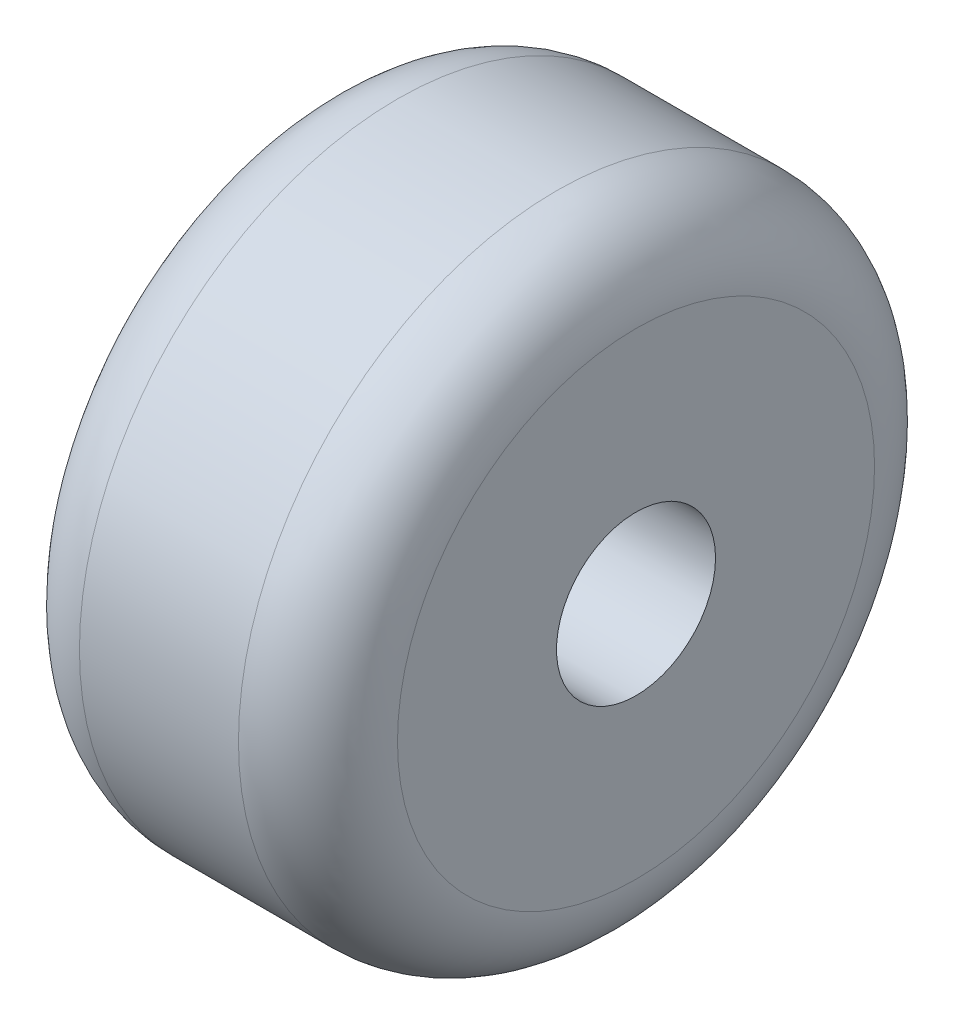
ISO-10303-21;
HEADER;
FILE_DESCRIPTION(('STEP AP214'),'2;1');
FILE_NAME('part.step','',(''),(''),'','','');
FILE_SCHEMA(('AUTOMOTIVE_DESIGN { 1 0 10303 214 1 1 1 1 }'));
ENDSEC;
DATA;
#1=APPLICATION_CONTEXT('core data for automotive mechanical design processes');
#2=APPLICATION_PROTOCOL_DEFINITION('international standard','automotive_design',2000,#1);
#3=PRODUCT_CONTEXT('',#1,'mechanical');
#4=PRODUCT('Part','Part','',(#3));
#5=PRODUCT_RELATED_PRODUCT_CATEGORY('part','',(#4));
#6=PRODUCT_DEFINITION_FORMATION('','',#4);
#7=PRODUCT_DEFINITION_CONTEXT('part definition',#1,'design');
#8=PRODUCT_DEFINITION('design','',#6,#7);
#9=PRODUCT_DEFINITION_SHAPE('','',#8);
#10=(LENGTH_UNIT() NAMED_UNIT(*) SI_UNIT(.MILLI.,.METRE.));
#11=(NAMED_UNIT(*) PLANE_ANGLE_UNIT() SI_UNIT($,.RADIAN.));
#12=(NAMED_UNIT(*) SI_UNIT($,.STERADIAN.) SOLID_ANGLE_UNIT());
#13=UNCERTAINTY_MEASURE_WITH_UNIT(LENGTH_MEASURE(1.E-05),#10,'distance_accuracy_value','');
#14=(GEOMETRIC_REPRESENTATION_CONTEXT(3) GLOBAL_UNCERTAINTY_ASSIGNED_CONTEXT((#13)) GLOBAL_UNIT_ASSIGNED_CONTEXT((#10,
#11,#12)) REPRESENTATION_CONTEXT('',''));
#15=CARTESIAN_POINT('',(0.,0.,0.));
#16=DIRECTION('',(0.,0.,1.));
#17=DIRECTION('',(1.,0.,0.));
#18=AXIS2_PLACEMENT_3D('',#15,#16,#17);
#19=CARTESIAN_POINT('',(25.4,0.,0.));
#20=DIRECTION('',(-1.,0.,0.));
#21=DIRECTION('',(0.,0.,1.));
#22=AXIS2_PLACEMENT_3D('',#19,#20,#21);
#23=CYLINDRICAL_SURFACE('',#22,25.4);
#24=CARTESIAN_POINT('',(6.35,0.,0.));
#25=DIRECTION('',(1.,0.,0.));
#26=DIRECTION('',(0.,0.,-1.));
#27=AXIS2_PLACEMENT_3D('',#24,#25,#26);
#28=CIRCLE('',#27,25.4);
#29=CARTESIAN_POINT('',(6.35,0.,-25.4));
#30=VERTEX_POINT('',#29);
#31=EDGE_CURVE('E58',#30,#30,#28,.T.);
#32=ORIENTED_EDGE('',*,*,#31,.T.);
#33=EDGE_LOOP('',(#32));
#34=FACE_BOUND('',#33,.T.);
#35=CARTESIAN_POINT('',(19.05,0.,0.));
#36=DIRECTION('',(1.,0.,0.));
#37=DIRECTION('',(0.,0.,-1.));
#38=AXIS2_PLACEMENT_3D('',#35,#36,#37);
#39=CIRCLE('',#38,25.4);
#40=CARTESIAN_POINT('',(19.05,0.,-25.4));
#41=VERTEX_POINT('',#40);
#42=EDGE_CURVE('E63',#41,#41,#39,.F.);
#43=ORIENTED_EDGE('',*,*,#42,.T.);
#44=EDGE_LOOP('',(#43));
#45=FACE_BOUND('',#44,.T.);
#46=ADVANCED_FACE('F45',(#34,#45),#23,.T.);
#47=CARTESIAN_POINT('',(25.4,0.,0.));
#48=DIRECTION('',(1.,0.,0.));
#49=DIRECTION('',(0.,0.,-1.));
#50=AXIS2_PLACEMENT_3D('',#47,#48,#49);
#51=PLANE('',#50);
#52=CARTESIAN_POINT('',(25.4,0.,0.));
#53=DIRECTION('',(1.,0.,0.));
#54=DIRECTION('',(0.,0.,-1.));
#55=AXIS2_PLACEMENT_3D('',#52,#53,#54);
#56=CIRCLE('',#55,6.35);
#57=CARTESIAN_POINT('',(25.4,0.,-6.35));
#58=VERTEX_POINT('',#57);
#59=EDGE_CURVE('E70',#58,#58,#56,.T.);
#60=ORIENTED_EDGE('',*,*,#59,.F.);
#61=EDGE_LOOP('',(#60));
#62=FACE_BOUND('',#61,.T.);
#63=CARTESIAN_POINT('',(25.4,0.,0.));
#64=DIRECTION('',(1.,0.,0.));
#65=DIRECTION('',(0.,0.,-1.));
#66=AXIS2_PLACEMENT_3D('',#63,#64,#65);
#67=CIRCLE('',#66,19.05);
#68=CARTESIAN_POINT('',(25.4,0.,-19.05));
#69=VERTEX_POINT('',#68);
#70=EDGE_CURVE('E10',#69,#69,#67,.T.);
#71=ORIENTED_EDGE('',*,*,#70,.T.);
#72=EDGE_LOOP('',(#71));
#73=FACE_BOUND('',#72,.T.);
#74=ADVANCED_FACE('F86',(#62,#73),#51,.T.);
#75=CARTESIAN_POINT('',(0.,0.,0.));
#76=DIRECTION('',(1.,0.,0.));
#77=DIRECTION('',(0.,0.,-1.));
#78=AXIS2_PLACEMENT_3D('',#75,#76,#77);
#79=PLANE('',#78);
#80=CARTESIAN_POINT('',(0.,0.,0.));
#81=DIRECTION('',(1.,0.,0.));
#82=DIRECTION('',(0.,0.,-1.));
#83=AXIS2_PLACEMENT_3D('',#80,#81,#82);
#84=CIRCLE('',#83,6.35);
#85=CARTESIAN_POINT('',(0.,0.,-6.35));
#86=VERTEX_POINT('',#85);
#87=EDGE_CURVE('E69',#86,#86,#84,.T.);
#88=ORIENTED_EDGE('',*,*,#87,.T.);
#89=EDGE_LOOP('',(#88));
#90=FACE_BOUND('',#89,.T.);
#91=CARTESIAN_POINT('',(0.,0.,0.));
#92=DIRECTION('',(1.,0.,0.));
#93=DIRECTION('',(0.,0.,-1.));
#94=AXIS2_PLACEMENT_3D('',#91,#92,#93);
#95=CIRCLE('',#94,19.05);
#96=CARTESIAN_POINT('',(0.,0.,-19.05));
#97=VERTEX_POINT('',#96);
#98=EDGE_CURVE('E53',#97,#97,#95,.F.);
#99=ORIENTED_EDGE('',*,*,#98,.T.);
#100=EDGE_LOOP('',(#99));
#101=FACE_BOUND('',#100,.T.);
#102=ADVANCED_FACE('F78',(#90,#101),#79,.F.);
#103=CARTESIAN_POINT('',(6.35,0.,0.));
#104=DIRECTION('',(1.,0.,0.));
#105=DIRECTION('',(0.,0.,-1.));
#106=AXIS2_PLACEMENT_3D('',#103,#104,#105);
#107=TOROIDAL_SURFACE('',#106,19.05,6.35);
#108=ORIENTED_EDGE('',*,*,#98,.F.);
#109=EDGE_LOOP('',(#108));
#110=FACE_BOUND('',#109,.T.);
#111=ORIENTED_EDGE('',*,*,#31,.F.);
#112=EDGE_LOOP('',(#111));
#113=FACE_BOUND('',#112,.T.);
#114=ADVANCED_FACE('F93',(#110,#113),#107,.T.);
#115=CARTESIAN_POINT('',(19.05,0.,0.));
#116=DIRECTION('',(1.,0.,0.));
#117=DIRECTION('',(0.,0.,-1.));
#118=AXIS2_PLACEMENT_3D('',#115,#116,#117);
#119=TOROIDAL_SURFACE('',#118,19.05,6.35);
#120=ORIENTED_EDGE('',*,*,#42,.F.);
#121=EDGE_LOOP('',(#120));
#122=FACE_BOUND('',#121,.T.);
#123=ORIENTED_EDGE('',*,*,#70,.F.);
#124=EDGE_LOOP('',(#123));
#125=FACE_BOUND('',#124,.T.);
#126=ADVANCED_FACE('F47',(#122,#125),#119,.T.);
#127=CARTESIAN_POINT('',(0.,0.,0.));
#128=DIRECTION('',(1.,0.,0.));
#129=DIRECTION('',(0.,0.,-1.));
#130=AXIS2_PLACEMENT_3D('',#127,#128,#129);
#131=CYLINDRICAL_SURFACE('',#130,6.35);
#132=ORIENTED_EDGE('',*,*,#87,.F.);
#133=EDGE_LOOP('',(#132));
#134=FACE_BOUND('',#133,.T.);
#135=ORIENTED_EDGE('',*,*,#59,.T.);
#136=EDGE_LOOP('',(#135));
#137=FACE_BOUND('',#136,.T.);
#138=ADVANCED_FACE('F80',(#134,#137),#131,.F.);
#139=CLOSED_SHELL('',(#46,#74,#102,#114,#126,#138));
#140=MANIFOLD_SOLID_BREP('B2',#139);
#141=ADVANCED_BREP_SHAPE_REPRESENTATION('',(#18,#140),#14);
#142=SHAPE_DEFINITION_REPRESENTATION(#9,#141);
ENDSEC;
END-ISO-10303-21;
